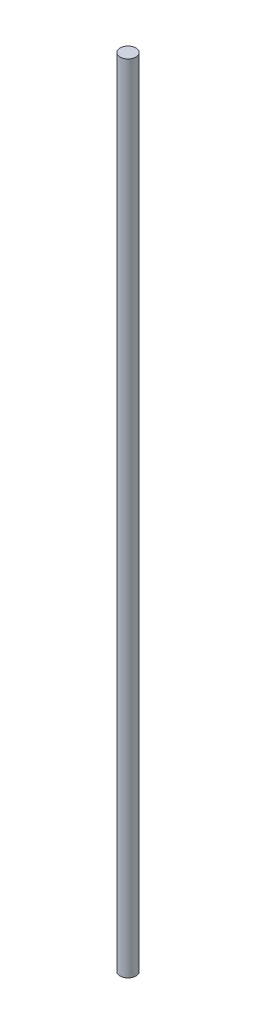
ISO-10303-21;
HEADER;
FILE_DESCRIPTION(('STEP AP214'),'2;1');
FILE_NAME('part.step','',(''),(''),'','','');
FILE_SCHEMA(('AUTOMOTIVE_DESIGN { 1 0 10303 214 1 1 1 1 }'));
ENDSEC;
DATA;
#1=APPLICATION_CONTEXT('core data for automotive mechanical design processes');
#2=APPLICATION_PROTOCOL_DEFINITION('international standard','automotive_design',2000,#1);
#3=PRODUCT_CONTEXT('',#1,'mechanical');
#4=PRODUCT('Part','Part','',(#3));
#5=PRODUCT_RELATED_PRODUCT_CATEGORY('part','',(#4));
#6=PRODUCT_DEFINITION_FORMATION('','',#4);
#7=PRODUCT_DEFINITION_CONTEXT('part definition',#1,'design');
#8=PRODUCT_DEFINITION('design','',#6,#7);
#9=PRODUCT_DEFINITION_SHAPE('','',#8);
#10=(LENGTH_UNIT() NAMED_UNIT(*) SI_UNIT(.MILLI.,.METRE.));
#11=(NAMED_UNIT(*) PLANE_ANGLE_UNIT() SI_UNIT($,.RADIAN.));
#12=(NAMED_UNIT(*) SI_UNIT($,.STERADIAN.) SOLID_ANGLE_UNIT());
#13=UNCERTAINTY_MEASURE_WITH_UNIT(LENGTH_MEASURE(1.E-05),#10,'distance_accuracy_value','');
#14=(GEOMETRIC_REPRESENTATION_CONTEXT(3) GLOBAL_UNCERTAINTY_ASSIGNED_CONTEXT((#13)) GLOBAL_UNIT_ASSIGNED_CONTEXT((#10,
#11,#12)) REPRESENTATION_CONTEXT('',''));
#15=CARTESIAN_POINT('',(0.,0.,0.));
#16=DIRECTION('',(0.,0.,1.));
#17=DIRECTION('',(1.,0.,0.));
#18=AXIS2_PLACEMENT_3D('',#15,#16,#17);
#19=CARTESIAN_POINT('',(0.,1200.,0.));
#20=DIRECTION('',(0.,-1.,0.));
#21=DIRECTION('',(0.,0.,-1.));
#22=AXIS2_PLACEMENT_3D('',#19,#20,#21);
#23=CYLINDRICAL_SURFACE('',#22,12.);
#24=CARTESIAN_POINT('',(0.,1200.,0.));
#25=DIRECTION('',(0.,1.,0.));
#26=DIRECTION('',(0.,0.,1.));
#27=AXIS2_PLACEMENT_3D('',#24,#25,#26);
#28=CIRCLE('',#27,12.);
#29=CARTESIAN_POINT('',(0.,1200.,12.));
#30=VERTEX_POINT('',#29);
#31=EDGE_CURVE('E10',#30,#30,#28,.T.);
#32=ORIENTED_EDGE('',*,*,#31,.F.);
#33=EDGE_LOOP('',(#32));
#34=FACE_BOUND('',#33,.T.);
#35=CARTESIAN_POINT('',(0.,0.,0.));
#36=DIRECTION('',(0.,1.,0.));
#37=DIRECTION('',(0.,0.,1.));
#38=AXIS2_PLACEMENT_3D('',#35,#36,#37);
#39=CIRCLE('',#38,12.);
#40=CARTESIAN_POINT('',(0.,0.,12.));
#41=VERTEX_POINT('',#40);
#42=EDGE_CURVE('E48',#41,#41,#39,.T.);
#43=ORIENTED_EDGE('',*,*,#42,.T.);
#44=EDGE_LOOP('',(#43));
#45=FACE_BOUND('',#44,.T.);
#46=ADVANCED_FACE('F45',(#34,#45),#23,.T.);
#47=CARTESIAN_POINT('',(0.,1200.,0.));
#48=DIRECTION('',(0.,1.,0.));
#49=DIRECTION('',(0.,0.,1.));
#50=AXIS2_PLACEMENT_3D('',#47,#48,#49);
#51=PLANE('',#50);
#52=ORIENTED_EDGE('',*,*,#31,.T.);
#53=EDGE_LOOP('',(#52));
#54=FACE_BOUND('',#53,.T.);
#55=ADVANCED_FACE('F62',(#54),#51,.T.);
#56=CARTESIAN_POINT('',(0.,0.,0.));
#57=DIRECTION('',(0.,1.,0.));
#58=DIRECTION('',(0.,0.,1.));
#59=AXIS2_PLACEMENT_3D('',#56,#57,#58);
#60=PLANE('',#59);
#61=ORIENTED_EDGE('',*,*,#42,.F.);
#62=EDGE_LOOP('',(#61));
#63=FACE_BOUND('',#62,.T.);
#64=ADVANCED_FACE('F60',(#63),#60,.F.);
#65=CLOSED_SHELL('',(#46,#55,#64));
#66=MANIFOLD_SOLID_BREP('B2',#65);
#67=ADVANCED_BREP_SHAPE_REPRESENTATION('',(#18,#66),#14);
#68=SHAPE_DEFINITION_REPRESENTATION(#9,#67);
ENDSEC;
END-ISO-10303-21;
